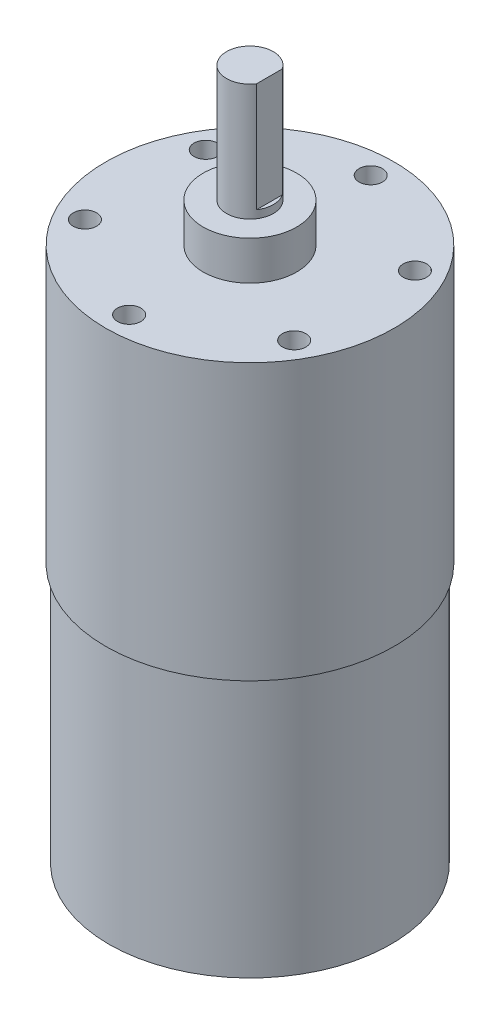
ISO-10303-21;
HEADER;
FILE_DESCRIPTION(('STEP AP214'),'2;1');
FILE_NAME('part.step','',(''),(''),'','','');
FILE_SCHEMA(('AUTOMOTIVE_DESIGN { 1 0 10303 214 1 1 1 1 }'));
ENDSEC;
DATA;
#1=APPLICATION_CONTEXT('core data for automotive mechanical design processes');
#2=APPLICATION_PROTOCOL_DEFINITION('international standard','automotive_design',2000,#1);
#3=PRODUCT_CONTEXT('',#1,'mechanical');
#4=PRODUCT('Part','Part','',(#3));
#5=PRODUCT_RELATED_PRODUCT_CATEGORY('part','',(#4));
#6=PRODUCT_DEFINITION_FORMATION('','',#4);
#7=PRODUCT_DEFINITION_CONTEXT('part definition',#1,'design');
#8=PRODUCT_DEFINITION('design','',#6,#7);
#9=PRODUCT_DEFINITION_SHAPE('','',#8);
#10=(LENGTH_UNIT() NAMED_UNIT(*) SI_UNIT(.MILLI.,.METRE.));
#11=(NAMED_UNIT(*) PLANE_ANGLE_UNIT() SI_UNIT($,.RADIAN.));
#12=(NAMED_UNIT(*) SI_UNIT($,.STERADIAN.) SOLID_ANGLE_UNIT());
#13=UNCERTAINTY_MEASURE_WITH_UNIT(LENGTH_MEASURE(1.E-05),#10,'distance_accuracy_value','');
#14=(GEOMETRIC_REPRESENTATION_CONTEXT(3) GLOBAL_UNCERTAINTY_ASSIGNED_CONTEXT((#13)) GLOBAL_UNIT_ASSIGNED_CONTEXT((#10,
#11,#12)) REPRESENTATION_CONTEXT('',''));
#15=CARTESIAN_POINT('',(0.,0.,0.));
#16=DIRECTION('',(0.,0.,1.));
#17=DIRECTION('',(1.,0.,0.));
#18=AXIS2_PLACEMENT_3D('',#15,#16,#17);
#19=CARTESIAN_POINT('',(0.,33.3,0.));
#20=DIRECTION('',(0.,-1.,0.));
#21=DIRECTION('',(0.,0.,-1.));
#22=AXIS2_PLACEMENT_3D('',#19,#20,#21);
#23=CYLINDRICAL_SURFACE('',#22,18.1);
#24=CARTESIAN_POINT('',(0.,33.3,0.));
#25=DIRECTION('',(0.,1.,0.));
#26=DIRECTION('',(0.,0.,1.));
#27=AXIS2_PLACEMENT_3D('',#24,#25,#26);
#28=CIRCLE('',#27,18.1);
#29=CARTESIAN_POINT('',(0.,33.3,18.1));
#30=VERTEX_POINT('',#29);
#31=EDGE_CURVE('E103',#30,#30,#28,.T.);
#32=ORIENTED_EDGE('',*,*,#31,.F.);
#33=EDGE_LOOP('',(#32));
#34=FACE_BOUND('',#33,.T.);
#35=CARTESIAN_POINT('',(0.,0.,0.));
#36=DIRECTION('',(0.,1.,0.));
#37=DIRECTION('',(0.,0.,1.));
#38=AXIS2_PLACEMENT_3D('',#35,#36,#37);
#39=CIRCLE('',#38,18.1);
#40=CARTESIAN_POINT('',(0.,0.,18.1));
#41=VERTEX_POINT('',#40);
#42=EDGE_CURVE('E108',#41,#41,#39,.T.);
#43=ORIENTED_EDGE('',*,*,#42,.T.);
#44=EDGE_LOOP('',(#43));
#45=FACE_BOUND('',#44,.T.);
#46=ADVANCED_FACE('F44',(#34,#45),#23,.T.);
#47=CARTESIAN_POINT('',(0.,0.,0.));
#48=DIRECTION('',(0.,1.,0.));
#49=DIRECTION('',(0.,0.,1.));
#50=AXIS2_PLACEMENT_3D('',#47,#48,#49);
#51=PLANE('',#50);
#52=ORIENTED_EDGE('',*,*,#42,.F.);
#53=EDGE_LOOP('',(#52));
#54=FACE_BOUND('',#53,.T.);
#55=ADVANCED_FACE('F121',(#54),#51,.F.);
#56=CARTESIAN_POINT('',(0.,68.6568,0.));
#57=DIRECTION('',(0.,-1.,0.));
#58=DIRECTION('',(0.,0.,-1.));
#59=AXIS2_PLACEMENT_3D('',#56,#57,#58);
#60=CYLINDRICAL_SURFACE('',#59,18.5);
#61=CARTESIAN_POINT('',(0.,68.6568,0.));
#62=DIRECTION('',(0.,1.,0.));
#63=DIRECTION('',(0.,0.,1.));
#64=AXIS2_PLACEMENT_3D('',#61,#62,#63);
#65=CIRCLE('',#64,18.5);
#66=CARTESIAN_POINT('',(0.,68.6568,18.5));
#67=VERTEX_POINT('',#66);
#68=EDGE_CURVE('E104',#67,#67,#65,.T.);
#69=ORIENTED_EDGE('',*,*,#68,.F.);
#70=EDGE_LOOP('',(#69));
#71=FACE_BOUND('',#70,.T.);
#72=CARTESIAN_POINT('',(0.,33.3,0.));
#73=DIRECTION('',(0.,1.,0.));
#74=DIRECTION('',(0.,0.,1.));
#75=AXIS2_PLACEMENT_3D('',#72,#73,#74);
#76=CIRCLE('',#75,18.5);
#77=CARTESIAN_POINT('',(0.,33.3,18.5));
#78=VERTEX_POINT('',#77);
#79=EDGE_CURVE('E99',#78,#78,#76,.T.);
#80=ORIENTED_EDGE('',*,*,#79,.T.);
#81=EDGE_LOOP('',(#80));
#82=FACE_BOUND('',#81,.T.);
#83=ADVANCED_FACE('F123',(#71,#82),#60,.T.);
#84=CARTESIAN_POINT('',(0.,68.6568,0.));
#85=DIRECTION('',(0.,1.,0.));
#86=DIRECTION('',(0.,0.,1.));
#87=AXIS2_PLACEMENT_3D('',#84,#85,#86);
#88=PLANE('',#87);
#89=CARTESIAN_POINT('',(-13.4233937586587,68.6568,-7.75000000000016));
#90=DIRECTION('',(0.,1.,0.));
#91=DIRECTION('',(0.866025403784433,0.,0.50000000000001));
#92=AXIS2_PLACEMENT_3D('',#89,#90,#91);
#93=CIRCLE('',#92,1.5);
#94=CARTESIAN_POINT('',(-12.1243556529821,68.6568,-7.00000000000014));
#95=VERTEX_POINT('',#94);
#96=EDGE_CURVE('E242',#95,#95,#93,.T.);
#97=ORIENTED_EDGE('',*,*,#96,.F.);
#98=EDGE_LOOP('',(#97));
#99=FACE_BOUND('',#98,.T.);
#100=CARTESIAN_POINT('',(-13.4233937586589,68.6568,7.74999999999987));
#101=DIRECTION('',(0.,1.,0.));
#102=DIRECTION('',(0.866025403784443,0.,-0.499999999999992));
#103=AXIS2_PLACEMENT_3D('',#100,#101,#102);
#104=CIRCLE('',#103,1.5);
#105=CARTESIAN_POINT('',(-12.1243556529822,68.6568,6.99999999999989));
#106=VERTEX_POINT('',#105);
#107=EDGE_CURVE('E234',#106,#106,#104,.T.);
#108=ORIENTED_EDGE('',*,*,#107,.F.);
#109=EDGE_LOOP('',(#108));
#110=FACE_BOUND('',#109,.T.);
#111=CARTESIAN_POINT('',(0.,68.6568,15.5));
#112=DIRECTION('',(0.,1.,0.));
#113=DIRECTION('',(0.,0.,-1.));
#114=AXIS2_PLACEMENT_3D('',#111,#112,#113);
#115=CIRCLE('',#114,1.5);
#116=CARTESIAN_POINT('',(0.,68.6568,14.));
#117=VERTEX_POINT('',#116);
#118=EDGE_CURVE('E226',#117,#117,#115,.T.);
#119=ORIENTED_EDGE('',*,*,#118,.F.);
#120=EDGE_LOOP('',(#119));
#121=FACE_BOUND('',#120,.T.);
#122=CARTESIAN_POINT('',(13.4233937586588,68.6568,7.75000000000006));
#123=DIRECTION('',(0.,1.,0.));
#124=DIRECTION('',(-0.866025403784436,0.,-0.500000000000004));
#125=AXIS2_PLACEMENT_3D('',#122,#123,#124);
#126=CIRCLE('',#125,1.5);
#127=CARTESIAN_POINT('',(12.1243556529821,68.6568,7.00000000000006));
#128=VERTEX_POINT('',#127);
#129=EDGE_CURVE('E212',#128,#128,#126,.T.);
#130=ORIENTED_EDGE('',*,*,#129,.F.);
#131=EDGE_LOOP('',(#130));
#132=FACE_BOUND('',#131,.T.);
#133=CARTESIAN_POINT('',(13.4233937586588,68.6568,-7.74999999999997));
#134=DIRECTION('',(0.,1.,0.));
#135=DIRECTION('',(-0.86602540378444,0.,0.499999999999998));
#136=AXIS2_PLACEMENT_3D('',#133,#134,#135);
#137=CIRCLE('',#136,1.5);
#138=CARTESIAN_POINT('',(12.1243556529822,68.6568,-6.99999999999997));
#139=VERTEX_POINT('',#138);
#140=EDGE_CURVE('E211',#139,#139,#137,.T.);
#141=ORIENTED_EDGE('',*,*,#140,.F.);
#142=EDGE_LOOP('',(#141));
#143=FACE_BOUND('',#142,.T.);
#144=CARTESIAN_POINT('',(0.,68.6568,-15.5));
#145=DIRECTION('',(0.,1.,0.));
#146=DIRECTION('',(0.,0.,1.));
#147=AXIS2_PLACEMENT_3D('',#144,#145,#146);
#148=CIRCLE('',#147,1.5);
#149=CARTESIAN_POINT('',(0.,68.6568,-14.));
#150=VERTEX_POINT('',#149);
#151=EDGE_CURVE('E248',#150,#150,#148,.T.);
#152=ORIENTED_EDGE('',*,*,#151,.F.);
#153=EDGE_LOOP('',(#152));
#154=FACE_BOUND('',#153,.T.);
#155=CARTESIAN_POINT('',(0.,68.6568,0.));
#156=DIRECTION('',(0.,1.,0.));
#157=DIRECTION('',(0.,0.,1.));
#158=AXIS2_PLACEMENT_3D('',#155,#156,#157);
#159=CIRCLE('',#158,6.);
#160=CARTESIAN_POINT('',(0.,68.6568,6.));
#161=VERTEX_POINT('',#160);
#162=EDGE_CURVE('E95',#161,#161,#159,.T.);
#163=ORIENTED_EDGE('',*,*,#162,.F.);
#164=EDGE_LOOP('',(#163));
#165=FACE_BOUND('',#164,.T.);
#166=ORIENTED_EDGE('',*,*,#68,.T.);
#167=EDGE_LOOP('',(#166));
#168=FACE_BOUND('',#167,.T.);
#169=ADVANCED_FACE('F128',(#99,#110,#121,#132,#143,#154,#165,#168),#88,.T.);
#170=CARTESIAN_POINT('',(0.,33.3,0.));
#171=DIRECTION('',(0.,1.,0.));
#172=DIRECTION('',(0.,0.,1.));
#173=AXIS2_PLACEMENT_3D('',#170,#171,#172);
#174=PLANE('',#173);
#175=ORIENTED_EDGE('',*,*,#31,.T.);
#176=EDGE_LOOP('',(#175));
#177=FACE_BOUND('',#176,.T.);
#178=ORIENTED_EDGE('',*,*,#79,.F.);
#179=EDGE_LOOP('',(#178));
#180=FACE_BOUND('',#179,.T.);
#181=ADVANCED_FACE('F133',(#177,#180),#174,.F.);
#182=CARTESIAN_POINT('',(0.,73.6568,0.));
#183=DIRECTION('',(0.,-1.,0.));
#184=DIRECTION('',(0.,0.,-1.));
#185=AXIS2_PLACEMENT_3D('',#182,#183,#184);
#186=CYLINDRICAL_SURFACE('',#185,6.);
#187=CARTESIAN_POINT('',(0.,73.6568,0.));
#188=DIRECTION('',(0.,1.,0.));
#189=DIRECTION('',(0.,0.,1.));
#190=AXIS2_PLACEMENT_3D('',#187,#188,#189);
#191=CIRCLE('',#190,6.);
#192=CARTESIAN_POINT('',(0.,73.6568,6.));
#193=VERTEX_POINT('',#192);
#194=EDGE_CURVE('E87',#193,#193,#191,.T.);
#195=ORIENTED_EDGE('',*,*,#194,.F.);
#196=EDGE_LOOP('',(#195));
#197=FACE_BOUND('',#196,.T.);
#198=ORIENTED_EDGE('',*,*,#162,.T.);
#199=EDGE_LOOP('',(#198));
#200=FACE_BOUND('',#199,.T.);
#201=ADVANCED_FACE('F136',(#197,#200),#186,.T.);
#202=CARTESIAN_POINT('',(0.,73.6568,0.));
#203=DIRECTION('',(0.,1.,0.));
#204=DIRECTION('',(0.,0.,1.));
#205=AXIS2_PLACEMENT_3D('',#202,#203,#204);
#206=PLANE('',#205);
#207=CARTESIAN_POINT('',(0.,73.6568,0.));
#208=DIRECTION('',(0.,1.,0.));
#209=DIRECTION('',(0.,0.,1.));
#210=AXIS2_PLACEMENT_3D('',#207,#208,#209);
#211=CIRCLE('',#210,3.);
#212=CARTESIAN_POINT('',(0.,73.6568,3.));
#213=VERTEX_POINT('',#212);
#214=EDGE_CURVE('E91',#213,#213,#211,.T.);
#215=ORIENTED_EDGE('',*,*,#214,.F.);
#216=EDGE_LOOP('',(#215));
#217=FACE_BOUND('',#216,.T.);
#218=ORIENTED_EDGE('',*,*,#194,.T.);
#219=EDGE_LOOP('',(#218));
#220=FACE_BOUND('',#219,.T.);
#221=ADVANCED_FACE('F143',(#217,#220),#206,.T.);
#222=CARTESIAN_POINT('',(0.,88.6568,0.));
#223=DIRECTION('',(0.,-1.,0.));
#224=DIRECTION('',(0.,0.,-1.));
#225=AXIS2_PLACEMENT_3D('',#222,#223,#224);
#226=CYLINDRICAL_SURFACE('',#225,3.);
#227=CARTESIAN_POINT('',(0.,88.6568,0.));
#228=DIRECTION('',(0.,1.,0.));
#229=DIRECTION('',(0.,0.,1.));
#230=AXIS2_PLACEMENT_3D('',#227,#228,#229);
#231=CIRCLE('',#230,3.);
#232=CARTESIAN_POINT('',(2.5,88.6568,-1.6583123951777));
#233=VERTEX_POINT('',#232);
#234=CARTESIAN_POINT('',(2.5,88.6568,1.6583123951777));
#235=VERTEX_POINT('',#234);
#236=EDGE_CURVE('E82',#233,#235,#231,.T.);
#237=ORIENTED_EDGE('',*,*,#236,.F.);
#238=DIRECTION('',(0.,-1.,0.));
#239=VECTOR('',#238,1.);
#240=CARTESIAN_POINT('',(2.5,88.6568,-1.6583123951777));
#241=LINE('',#240,#239);
#242=CARTESIAN_POINT('',(2.5,74.6568,-1.6583123951777));
#243=VERTEX_POINT('',#242);
#244=EDGE_CURVE('E59',#233,#243,#241,.T.);
#245=ORIENTED_EDGE('',*,*,#244,.T.);
#246=CARTESIAN_POINT('',(0.,74.6568,0.));
#247=DIRECTION('',(0.,-1.,0.));
#248=DIRECTION('',(0.,0.,-1.));
#249=AXIS2_PLACEMENT_3D('',#246,#247,#248);
#250=CIRCLE('',#249,3.);
#251=CARTESIAN_POINT('',(2.5,74.6568,1.6583123951777));
#252=VERTEX_POINT('',#251);
#253=EDGE_CURVE('E11',#243,#252,#250,.T.);
#254=ORIENTED_EDGE('',*,*,#253,.T.);
#255=DIRECTION('',(0.,-1.,0.));
#256=VECTOR('',#255,1.);
#257=CARTESIAN_POINT('',(2.5,88.6568,1.6583123951777));
#258=LINE('',#257,#256);
#259=EDGE_CURVE('E74',#252,#235,#258,.F.);
#260=ORIENTED_EDGE('',*,*,#259,.T.);
#261=EDGE_LOOP('',(#237,#245,#254,#260));
#262=FACE_BOUND('',#261,.T.);
#263=ORIENTED_EDGE('',*,*,#214,.T.);
#264=EDGE_LOOP('',(#263));
#265=FACE_BOUND('',#264,.T.);
#266=ADVANCED_FACE('F79',(#262,#265),#226,.T.);
#267=CARTESIAN_POINT('',(0.,88.6568,0.));
#268=DIRECTION('',(0.,1.,0.));
#269=DIRECTION('',(0.,0.,1.));
#270=AXIS2_PLACEMENT_3D('',#267,#268,#269);
#271=PLANE('',#270);
#272=DIRECTION('',(0.,0.,1.));
#273=VECTOR('',#272,1.);
#274=CARTESIAN_POINT('',(2.5,88.6568,0.));
#275=LINE('',#274,#273);
#276=EDGE_CURVE('E52',#233,#235,#275,.T.);
#277=ORIENTED_EDGE('',*,*,#276,.F.);
#278=ORIENTED_EDGE('',*,*,#236,.T.);
#279=EDGE_LOOP('',(#277,#278));
#280=FACE_BOUND('',#279,.T.);
#281=ADVANCED_FACE('F150',(#280),#271,.T.);
#282=CARTESIAN_POINT('',(3.,74.6568,-18.5));
#283=DIRECTION('',(0.,-1.,0.));
#284=DIRECTION('',(0.,0.,-1.));
#285=AXIS2_PLACEMENT_3D('',#282,#283,#284);
#286=PLANE('',#285);
#287=DIRECTION('',(0.,0.,1.));
#288=VECTOR('',#287,1.);
#289=CARTESIAN_POINT('',(2.5,74.6568,-18.5));
#290=LINE('',#289,#288);
#291=EDGE_CURVE('E71',#243,#252,#290,.T.);
#292=ORIENTED_EDGE('',*,*,#291,.T.);
#293=ORIENTED_EDGE('',*,*,#253,.F.);
#294=EDGE_LOOP('',(#292,#293));
#295=FACE_BOUND('',#294,.T.);
#296=ADVANCED_FACE('F70',(#295),#286,.F.);
#297=CARTESIAN_POINT('',(2.5,88.6568,-18.5));
#298=DIRECTION('',(-1.,0.,0.));
#299=DIRECTION('',(0.,-1.,0.));
#300=AXIS2_PLACEMENT_3D('',#297,#298,#299);
#301=PLANE('',#300);
#302=ORIENTED_EDGE('',*,*,#276,.T.);
#303=ORIENTED_EDGE('',*,*,#259,.F.);
#304=ORIENTED_EDGE('',*,*,#291,.F.);
#305=ORIENTED_EDGE('',*,*,#244,.F.);
#306=EDGE_LOOP('',(#302,#303,#304,#305));
#307=FACE_BOUND('',#306,.T.);
#308=ADVANCED_FACE('F73',(#307),#301,.F.);
#309=CARTESIAN_POINT('',(0.,58.6568,-15.5));
#310=DIRECTION('',(0.,1.,0.));
#311=DIRECTION('',(0.,0.,1.));
#312=AXIS2_PLACEMENT_3D('',#309,#310,#311);
#313=CYLINDRICAL_SURFACE('',#312,1.5);
#314=CARTESIAN_POINT('',(0.,58.6568,-15.5));
#315=DIRECTION('',(0.,1.,0.));
#316=DIRECTION('',(0.,0.,1.));
#317=AXIS2_PLACEMENT_3D('',#314,#315,#316);
#318=CIRCLE('',#317,1.5);
#319=CARTESIAN_POINT('',(0.,58.6568,-14.));
#320=VERTEX_POINT('',#319);
#321=EDGE_CURVE('E76',#320,#320,#318,.T.);
#322=ORIENTED_EDGE('',*,*,#321,.F.);
#323=EDGE_LOOP('',(#322));
#324=FACE_BOUND('',#323,.T.);
#325=ORIENTED_EDGE('',*,*,#151,.T.);
#326=EDGE_LOOP('',(#325));
#327=FACE_BOUND('',#326,.T.);
#328=ADVANCED_FACE('F156',(#324,#327),#313,.F.);
#329=CARTESIAN_POINT('',(0.,58.6568,-15.5));
#330=DIRECTION('',(0.,1.,0.));
#331=DIRECTION('',(0.,0.,1.));
#332=AXIS2_PLACEMENT_3D('',#329,#330,#331);
#333=PLANE('',#332);
#334=ORIENTED_EDGE('',*,*,#321,.T.);
#335=EDGE_LOOP('',(#334));
#336=FACE_BOUND('',#335,.T.);
#337=ADVANCED_FACE('F161',(#336),#333,.T.);
#338=CARTESIAN_POINT('',(13.4233937586588,58.6568,-7.74999999999997));
#339=DIRECTION('',(0.,1.,0.));
#340=DIRECTION('',(0.,0.,1.));
#341=AXIS2_PLACEMENT_3D('',#338,#339,#340);
#342=CYLINDRICAL_SURFACE('',#341,1.5);
#343=CARTESIAN_POINT('',(13.4233937586588,58.6568,-7.74999999999997));
#344=DIRECTION('',(0.,1.,0.));
#345=DIRECTION('',(-0.86602540378444,0.,0.499999999999998));
#346=AXIS2_PLACEMENT_3D('',#343,#344,#345);
#347=CIRCLE('',#346,1.5);
#348=CARTESIAN_POINT('',(12.1243556529822,58.6568,-6.99999999999997));
#349=VERTEX_POINT('',#348);
#350=EDGE_CURVE('E217',#349,#349,#347,.T.);
#351=ORIENTED_EDGE('',*,*,#350,.F.);
#352=EDGE_LOOP('',(#351));
#353=FACE_BOUND('',#352,.T.);
#354=ORIENTED_EDGE('',*,*,#140,.T.);
#355=EDGE_LOOP('',(#354));
#356=FACE_BOUND('',#355,.T.);
#357=ADVANCED_FACE('F165',(#353,#356),#342,.F.);
#358=CARTESIAN_POINT('',(13.4233937586588,58.6568,-7.74999999999997));
#359=DIRECTION('',(0.,1.,0.));
#360=DIRECTION('',(-0.86602540378444,0.,0.499999999999998));
#361=AXIS2_PLACEMENT_3D('',#358,#359,#360);
#362=PLANE('',#361);
#363=ORIENTED_EDGE('',*,*,#350,.T.);
#364=EDGE_LOOP('',(#363));
#365=FACE_BOUND('',#364,.T.);
#366=ADVANCED_FACE('F169',(#365),#362,.T.);
#367=CARTESIAN_POINT('',(13.4233937586588,58.6568,7.75000000000006));
#368=DIRECTION('',(0.,1.,0.));
#369=DIRECTION('',(0.,0.,1.));
#370=AXIS2_PLACEMENT_3D('',#367,#368,#369);
#371=CYLINDRICAL_SURFACE('',#370,1.5);
#372=CARTESIAN_POINT('',(13.4233937586588,58.6568,7.75000000000006));
#373=DIRECTION('',(0.,1.,0.));
#374=DIRECTION('',(-0.866025403784436,0.,-0.500000000000004));
#375=AXIS2_PLACEMENT_3D('',#372,#373,#374);
#376=CIRCLE('',#375,1.5);
#377=CARTESIAN_POINT('',(12.1243556529821,58.6568,7.00000000000006));
#378=VERTEX_POINT('',#377);
#379=EDGE_CURVE('E209',#378,#378,#376,.T.);
#380=ORIENTED_EDGE('',*,*,#379,.F.);
#381=EDGE_LOOP('',(#380));
#382=FACE_BOUND('',#381,.T.);
#383=ORIENTED_EDGE('',*,*,#129,.T.);
#384=EDGE_LOOP('',(#383));
#385=FACE_BOUND('',#384,.T.);
#386=ADVANCED_FACE('F173',(#382,#385),#371,.F.);
#387=CARTESIAN_POINT('',(13.4233937586588,58.6568,7.75000000000006));
#388=DIRECTION('',(0.,1.,0.));
#389=DIRECTION('',(-0.866025403784436,0.,-0.500000000000004));
#390=AXIS2_PLACEMENT_3D('',#387,#388,#389);
#391=PLANE('',#390);
#392=ORIENTED_EDGE('',*,*,#379,.T.);
#393=EDGE_LOOP('',(#392));
#394=FACE_BOUND('',#393,.T.);
#395=ADVANCED_FACE('F195',(#394),#391,.T.);
#396=CARTESIAN_POINT('',(0.,58.6568,15.5));
#397=DIRECTION('',(0.,1.,0.));
#398=DIRECTION('',(0.,0.,1.));
#399=AXIS2_PLACEMENT_3D('',#396,#397,#398);
#400=CYLINDRICAL_SURFACE('',#399,1.5);
#401=CARTESIAN_POINT('',(0.,58.6568,15.5));
#402=DIRECTION('',(0.,1.,0.));
#403=DIRECTION('',(0.,0.,-1.));
#404=AXIS2_PLACEMENT_3D('',#401,#402,#403);
#405=CIRCLE('',#404,1.5);
#406=CARTESIAN_POINT('',(0.,58.6568,14.));
#407=VERTEX_POINT('',#406);
#408=EDGE_CURVE('E220',#407,#407,#405,.T.);
#409=ORIENTED_EDGE('',*,*,#408,.F.);
#410=EDGE_LOOP('',(#409));
#411=FACE_BOUND('',#410,.T.);
#412=ORIENTED_EDGE('',*,*,#118,.T.);
#413=EDGE_LOOP('',(#412));
#414=FACE_BOUND('',#413,.T.);
#415=ADVANCED_FACE('F192',(#411,#414),#400,.F.);
#416=CARTESIAN_POINT('',(0.,58.6568,15.5));
#417=DIRECTION('',(0.,1.,0.));
#418=DIRECTION('',(0.,0.,-1.));
#419=AXIS2_PLACEMENT_3D('',#416,#417,#418);
#420=PLANE('',#419);
#421=ORIENTED_EDGE('',*,*,#408,.T.);
#422=EDGE_LOOP('',(#421));
#423=FACE_BOUND('',#422,.T.);
#424=ADVANCED_FACE('F187',(#423),#420,.T.);
#425=CARTESIAN_POINT('',(-13.4233937586589,58.6568,7.74999999999987));
#426=DIRECTION('',(0.,1.,0.));
#427=DIRECTION('',(0.,0.,1.));
#428=AXIS2_PLACEMENT_3D('',#425,#426,#427);
#429=CYLINDRICAL_SURFACE('',#428,1.5);
#430=CARTESIAN_POINT('',(-13.4233937586589,58.6568,7.74999999999987));
#431=DIRECTION('',(0.,1.,0.));
#432=DIRECTION('',(0.866025403784443,0.,-0.499999999999992));
#433=AXIS2_PLACEMENT_3D('',#430,#431,#432);
#434=CIRCLE('',#433,1.5);
#435=CARTESIAN_POINT('',(-12.1243556529822,58.6568,6.99999999999989));
#436=VERTEX_POINT('',#435);
#437=EDGE_CURVE('E230',#436,#436,#434,.T.);
#438=ORIENTED_EDGE('',*,*,#437,.F.);
#439=EDGE_LOOP('',(#438));
#440=FACE_BOUND('',#439,.T.);
#441=ORIENTED_EDGE('',*,*,#107,.T.);
#442=EDGE_LOOP('',(#441));
#443=FACE_BOUND('',#442,.T.);
#444=ADVANCED_FACE('F184',(#440,#443),#429,.F.);
#445=CARTESIAN_POINT('',(-13.4233937586589,58.6568,7.74999999999987));
#446=DIRECTION('',(0.,1.,0.));
#447=DIRECTION('',(0.866025403784443,0.,-0.499999999999992));
#448=AXIS2_PLACEMENT_3D('',#445,#446,#447);
#449=PLANE('',#448);
#450=ORIENTED_EDGE('',*,*,#437,.T.);
#451=EDGE_LOOP('',(#450));
#452=FACE_BOUND('',#451,.T.);
#453=ADVANCED_FACE('F179',(#452),#449,.T.);
#454=CARTESIAN_POINT('',(-13.4233937586587,58.6568,-7.75000000000016));
#455=DIRECTION('',(0.,1.,0.));
#456=DIRECTION('',(0.,0.,1.));
#457=AXIS2_PLACEMENT_3D('',#454,#455,#456);
#458=CYLINDRICAL_SURFACE('',#457,1.5);
#459=CARTESIAN_POINT('',(-13.4233937586587,58.6568,-7.75000000000016));
#460=DIRECTION('',(0.,1.,0.));
#461=DIRECTION('',(0.866025403784433,0.,0.50000000000001));
#462=AXIS2_PLACEMENT_3D('',#459,#460,#461);
#463=CIRCLE('',#462,1.5);
#464=CARTESIAN_POINT('',(-12.1243556529821,58.6568,-7.00000000000014));
#465=VERTEX_POINT('',#464);
#466=EDGE_CURVE('E238',#465,#465,#463,.T.);
#467=ORIENTED_EDGE('',*,*,#466,.F.);
#468=EDGE_LOOP('',(#467));
#469=FACE_BOUND('',#468,.T.);
#470=ORIENTED_EDGE('',*,*,#96,.T.);
#471=EDGE_LOOP('',(#470));
#472=FACE_BOUND('',#471,.T.);
#473=ADVANCED_FACE('F175',(#469,#472),#458,.F.);
#474=CARTESIAN_POINT('',(-13.4233937586587,58.6568,-7.75000000000016));
#475=DIRECTION('',(0.,1.,0.));
#476=DIRECTION('',(0.866025403784433,0.,0.50000000000001));
#477=AXIS2_PLACEMENT_3D('',#474,#475,#476);
#478=PLANE('',#477);
#479=ORIENTED_EDGE('',*,*,#466,.T.);
#480=EDGE_LOOP('',(#479));
#481=FACE_BOUND('',#480,.T.);
#482=ADVANCED_FACE('F178',(#481),#478,.T.);
#483=CLOSED_SHELL('',(#46,#55,#83,#169,#181,#201,#221,#266,#281,#296,#308,#328,#337,#357,#366,
#386,#395,#415,#424,#444,#453,#473,#482));
#484=MANIFOLD_SOLID_BREP('B2',#483);
#485=ADVANCED_BREP_SHAPE_REPRESENTATION('',(#18,#484),#14);
#486=SHAPE_DEFINITION_REPRESENTATION(#9,#485);
ENDSEC;
END-ISO-10303-21;
